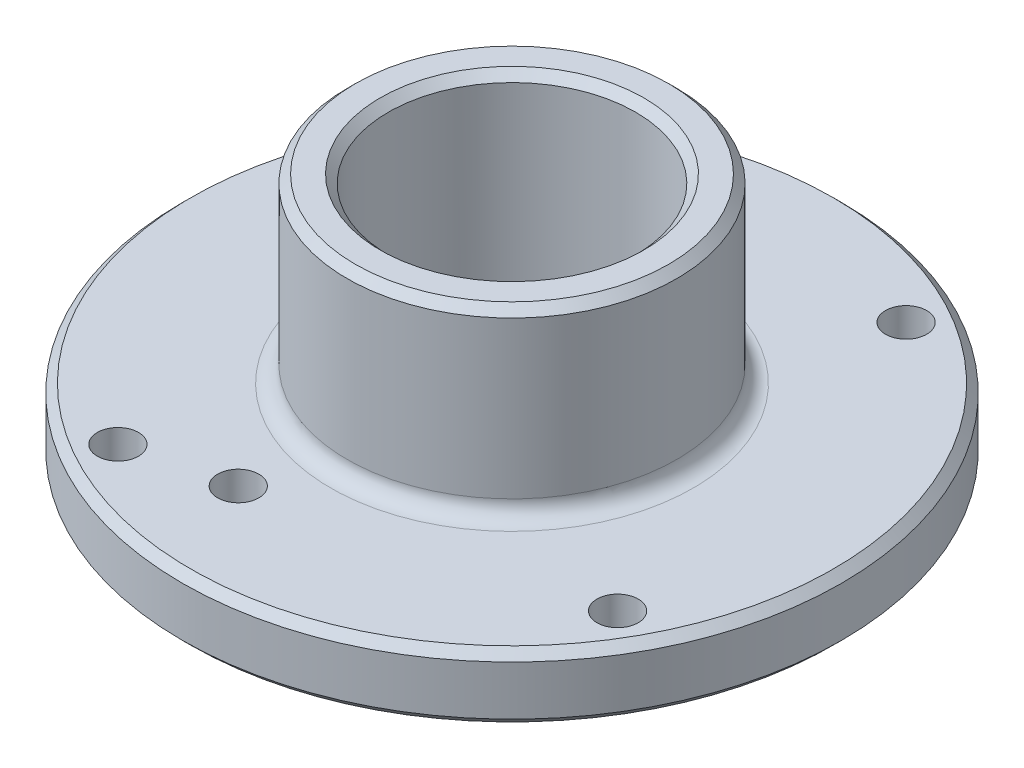
ISO-10303-21;
HEADER;
FILE_DESCRIPTION(('STEP AP214'),'2;1');
FILE_NAME('part.step','',(''),(''),'','','');
FILE_SCHEMA(('AUTOMOTIVE_DESIGN { 1 0 10303 214 1 1 1 1 }'));
ENDSEC;
DATA;
#1=APPLICATION_CONTEXT('core data for automotive mechanical design processes');
#2=APPLICATION_PROTOCOL_DEFINITION('international standard','automotive_design',2000,#1);
#3=PRODUCT_CONTEXT('',#1,'mechanical');
#4=PRODUCT('Part','Part','',(#3));
#5=PRODUCT_RELATED_PRODUCT_CATEGORY('part','',(#4));
#6=PRODUCT_DEFINITION_FORMATION('','',#4);
#7=PRODUCT_DEFINITION_CONTEXT('part definition',#1,'design');
#8=PRODUCT_DEFINITION('design','',#6,#7);
#9=PRODUCT_DEFINITION_SHAPE('','',#8);
#10=(LENGTH_UNIT() NAMED_UNIT(*) SI_UNIT(.MILLI.,.METRE.));
#11=(NAMED_UNIT(*) PLANE_ANGLE_UNIT() SI_UNIT($,.RADIAN.));
#12=(NAMED_UNIT(*) SI_UNIT($,.STERADIAN.) SOLID_ANGLE_UNIT());
#13=UNCERTAINTY_MEASURE_WITH_UNIT(LENGTH_MEASURE(1.E-05),#10,'distance_accuracy_value','');
#14=(GEOMETRIC_REPRESENTATION_CONTEXT(3) GLOBAL_UNCERTAINTY_ASSIGNED_CONTEXT((#13)) GLOBAL_UNIT_ASSIGNED_CONTEXT((#10,
#11,#12)) REPRESENTATION_CONTEXT('',''));
#15=CARTESIAN_POINT('',(0.,0.,0.));
#16=DIRECTION('',(0.,0.,1.));
#17=DIRECTION('',(1.,0.,0.));
#18=AXIS2_PLACEMENT_3D('',#15,#16,#17);
#19=CARTESIAN_POINT('',(-40.,0.,0.));
#20=DIRECTION('',(0.,1.,0.));
#21=DIRECTION('',(0.,0.,1.));
#22=AXIS2_PLACEMENT_3D('',#19,#20,#21);
#23=PLANE('',#22);
#24=CARTESIAN_POINT('',(-17.5,0.,30.3108891324553));
#25=DIRECTION('',(0.,1.,0.));
#26=DIRECTION('',(0.,0.,1.));
#27=AXIS2_PLACEMENT_3D('',#24,#25,#26);
#28=CIRCLE('',#27,2.5);
#29=CARTESIAN_POINT('',(-17.5,0.,32.8108891324554));
#30=VERTEX_POINT('',#29);
#31=EDGE_CURVE('E103',#30,#30,#28,.F.);
#32=ORIENTED_EDGE('',*,*,#31,.F.);
#33=EDGE_LOOP('',(#32));
#34=FACE_BOUND('',#33,.T.);
#35=CARTESIAN_POINT('',(-30.3108891324554,0.,-17.5));
#36=DIRECTION('',(0.,1.,0.));
#37=DIRECTION('',(0.,0.,1.));
#38=AXIS2_PLACEMENT_3D('',#35,#36,#37);
#39=CIRCLE('',#38,2.5);
#40=CARTESIAN_POINT('',(-30.3108891324554,0.,-15.));
#41=VERTEX_POINT('',#40);
#42=EDGE_CURVE('E117',#41,#41,#39,.F.);
#43=ORIENTED_EDGE('',*,*,#42,.F.);
#44=EDGE_LOOP('',(#43));
#45=FACE_BOUND('',#44,.T.);
#46=CARTESIAN_POINT('',(17.5,0.,-30.3108891324554));
#47=DIRECTION('',(0.,1.,0.));
#48=DIRECTION('',(0.,0.,1.));
#49=AXIS2_PLACEMENT_3D('',#46,#47,#48);
#50=CIRCLE('',#49,2.5);
#51=CARTESIAN_POINT('',(17.5,0.,-27.8108891324554));
#52=VERTEX_POINT('',#51);
#53=EDGE_CURVE('E108',#52,#52,#50,.F.);
#54=ORIENTED_EDGE('',*,*,#53,.F.);
#55=EDGE_LOOP('',(#54));
#56=FACE_BOUND('',#55,.T.);
#57=CARTESIAN_POINT('',(30.3108891324554,0.,17.5));
#58=DIRECTION('',(0.,1.,0.));
#59=DIRECTION('',(0.,0.,1.));
#60=AXIS2_PLACEMENT_3D('',#57,#58,#59);
#61=CIRCLE('',#60,2.50000000000001);
#62=CARTESIAN_POINT('',(30.3108891324554,0.,20.));
#63=VERTEX_POINT('',#62);
#64=EDGE_CURVE('E109',#63,#63,#61,.F.);
#65=ORIENTED_EDGE('',*,*,#64,.F.);
#66=EDGE_LOOP('',(#65));
#67=FACE_BOUND('',#66,.T.);
#68=CARTESIAN_POINT('',(-5.82152734289728,0.,27.3881328205466));
#69=DIRECTION('',(0.,-1.,0.));
#70=DIRECTION('',(0.,0.,-1.));
#71=AXIS2_PLACEMENT_3D('',#68,#69,#70);
#72=CIRCLE('',#71,2.5);
#73=CARTESIAN_POINT('',(-5.82152734289728,0.,24.8881328205466));
#74=VERTEX_POINT('',#73);
#75=EDGE_CURVE('E99',#74,#74,#72,.T.);
#76=ORIENTED_EDGE('',*,*,#75,.F.);
#77=EDGE_LOOP('',(#76));
#78=FACE_BOUND('',#77,.T.);
#79=CARTESIAN_POINT('',(0.,0.,0.));
#80=DIRECTION('',(0.,1.,0.));
#81=DIRECTION('',(0.,0.,1.));
#82=AXIS2_PLACEMENT_3D('',#79,#80,#81);
#83=CIRCLE('',#82,15.5);
#84=CARTESIAN_POINT('',(0.,0.,15.5));
#85=VERTEX_POINT('',#84);
#86=EDGE_CURVE('E10',#85,#85,#83,.T.);
#87=ORIENTED_EDGE('',*,*,#86,.T.);
#88=EDGE_LOOP('',(#87));
#89=FACE_BOUND('',#88,.T.);
#90=CARTESIAN_POINT('',(0.,0.,0.));
#91=DIRECTION('',(0.,1.,0.));
#92=DIRECTION('',(0.,0.,1.));
#93=AXIS2_PLACEMENT_3D('',#90,#91,#92);
#94=CIRCLE('',#93,39.);
#95=CARTESIAN_POINT('',(0.,0.,39.));
#96=VERTEX_POINT('',#95);
#97=EDGE_CURVE('E75',#96,#96,#94,.F.);
#98=ORIENTED_EDGE('',*,*,#97,.T.);
#99=EDGE_LOOP('',(#98));
#100=FACE_BOUND('',#99,.T.);
#101=ADVANCED_FACE('F42',(#34,#45,#56,#67,#78,#89,#100),#23,.F.);
#102=CARTESIAN_POINT('',(0.,0.,0.));
#103=DIRECTION('',(0.,-1.,0.));
#104=DIRECTION('',(0.,0.,-1.));
#105=AXIS2_PLACEMENT_3D('',#102,#103,#104);
#106=CYLINDRICAL_SURFACE('',#105,15.);
#107=CARTESIAN_POINT('',(0.,0.500000000000026,0.));
#108=DIRECTION('',(0.,1.,0.));
#109=DIRECTION('',(0.,0.,1.));
#110=AXIS2_PLACEMENT_3D('',#107,#108,#109);
#111=CIRCLE('',#110,15.);
#112=CARTESIAN_POINT('',(0.,0.500000000000026,15.));
#113=VERTEX_POINT('',#112);
#114=EDGE_CURVE('E52',#113,#113,#111,.F.);
#115=ORIENTED_EDGE('',*,*,#114,.T.);
#116=EDGE_LOOP('',(#115));
#117=FACE_BOUND('',#116,.T.);
#118=CARTESIAN_POINT('',(0.,29.,0.));
#119=DIRECTION('',(0.,-1.,0.));
#120=DIRECTION('',(0.,0.,-1.));
#121=AXIS2_PLACEMENT_3D('',#118,#119,#120);
#122=CIRCLE('',#121,15.);
#123=CARTESIAN_POINT('',(0.,29.,-15.));
#124=VERTEX_POINT('',#123);
#125=EDGE_CURVE('E63',#124,#124,#122,.F.);
#126=ORIENTED_EDGE('',*,*,#125,.T.);
#127=EDGE_LOOP('',(#126));
#128=FACE_BOUND('',#127,.T.);
#129=ADVANCED_FACE('F175',(#117,#128),#106,.F.);
#130=CARTESIAN_POINT('',(-15.,30.,0.));
#131=DIRECTION('',(0.,-1.,0.));
#132=DIRECTION('',(0.,0.,-1.));
#133=AXIS2_PLACEMENT_3D('',#130,#131,#132);
#134=PLANE('',#133);
#135=CARTESIAN_POINT('',(0.,30.,0.));
#136=DIRECTION('',(0.,-1.,0.));
#137=DIRECTION('',(0.,0.,-1.));
#138=AXIS2_PLACEMENT_3D('',#135,#136,#137);
#139=CIRCLE('',#138,16.);
#140=CARTESIAN_POINT('',(0.,30.,-16.));
#141=VERTEX_POINT('',#140);
#142=EDGE_CURVE('E67',#141,#141,#139,.T.);
#143=ORIENTED_EDGE('',*,*,#142,.T.);
#144=EDGE_LOOP('',(#143));
#145=FACE_BOUND('',#144,.T.);
#146=CARTESIAN_POINT('',(0.,30.,0.));
#147=DIRECTION('',(0.,-1.,0.));
#148=DIRECTION('',(0.,0.,-1.));
#149=AXIS2_PLACEMENT_3D('',#146,#147,#148);
#150=CIRCLE('',#149,19.);
#151=CARTESIAN_POINT('',(0.,30.,-19.));
#152=VERTEX_POINT('',#151);
#153=EDGE_CURVE('E71',#152,#152,#150,.F.);
#154=ORIENTED_EDGE('',*,*,#153,.T.);
#155=EDGE_LOOP('',(#154));
#156=FACE_BOUND('',#155,.T.);
#157=ADVANCED_FACE('F180',(#145,#156),#134,.F.);
#158=CARTESIAN_POINT('',(0.,0.,0.));
#159=DIRECTION('',(0.,-1.,0.));
#160=DIRECTION('',(0.,0.,-1.));
#161=AXIS2_PLACEMENT_3D('',#158,#159,#160);
#162=CYLINDRICAL_SURFACE('',#161,20.);
#163=CARTESIAN_POINT('',(0.,29.,0.));
#164=DIRECTION('',(0.,-1.,0.));
#165=DIRECTION('',(0.,0.,-1.));
#166=AXIS2_PLACEMENT_3D('',#163,#164,#165);
#167=CIRCLE('',#166,20.);
#168=CARTESIAN_POINT('',(0.,29.,-20.));
#169=VERTEX_POINT('',#168);
#170=EDGE_CURVE('E57',#169,#169,#167,.T.);
#171=ORIENTED_EDGE('',*,*,#170,.T.);
#172=EDGE_LOOP('',(#171));
#173=FACE_BOUND('',#172,.T.);
#174=CARTESIAN_POINT('',(0.,10.,0.));
#175=DIRECTION('',(0.,-1.,0.));
#176=DIRECTION('',(0.,0.,-1.));
#177=AXIS2_PLACEMENT_3D('',#174,#175,#176);
#178=CIRCLE('',#177,20.);
#179=CARTESIAN_POINT('',(0.,10.,-20.));
#180=VERTEX_POINT('',#179);
#181=EDGE_CURVE('E91',#180,#180,#178,.F.);
#182=ORIENTED_EDGE('',*,*,#181,.T.);
#183=EDGE_LOOP('',(#182));
#184=FACE_BOUND('',#183,.T.);
#185=ADVANCED_FACE('F143',(#173,#184),#162,.T.);
#186=CARTESIAN_POINT('',(-20.,8.,0.));
#187=DIRECTION('',(0.,-1.,0.));
#188=DIRECTION('',(0.,0.,-1.));
#189=AXIS2_PLACEMENT_3D('',#186,#187,#188);
#190=PLANE('',#189);
#191=CARTESIAN_POINT('',(-17.5,8.,30.3108891324553));
#192=DIRECTION('',(0.,1.,0.));
#193=DIRECTION('',(0.,0.,1.));
#194=AXIS2_PLACEMENT_3D('',#191,#192,#193);
#195=CIRCLE('',#194,2.5);
#196=CARTESIAN_POINT('',(-17.5,8.,32.8108891324554));
#197=VERTEX_POINT('',#196);
#198=EDGE_CURVE('E125',#197,#197,#195,.T.);
#199=ORIENTED_EDGE('',*,*,#198,.F.);
#200=EDGE_LOOP('',(#199));
#201=FACE_BOUND('',#200,.T.);
#202=CARTESIAN_POINT('',(-30.3108891324554,8.,-17.5));
#203=DIRECTION('',(0.,1.,0.));
#204=DIRECTION('',(0.,0.,1.));
#205=AXIS2_PLACEMENT_3D('',#202,#203,#204);
#206=CIRCLE('',#205,2.5);
#207=CARTESIAN_POINT('',(-30.3108891324554,8.,-15.));
#208=VERTEX_POINT('',#207);
#209=EDGE_CURVE('E121',#208,#208,#206,.T.);
#210=ORIENTED_EDGE('',*,*,#209,.F.);
#211=EDGE_LOOP('',(#210));
#212=FACE_BOUND('',#211,.T.);
#213=CARTESIAN_POINT('',(17.5,8.,-30.3108891324554));
#214=DIRECTION('',(0.,1.,0.));
#215=DIRECTION('',(0.,0.,1.));
#216=AXIS2_PLACEMENT_3D('',#213,#214,#215);
#217=CIRCLE('',#216,2.5);
#218=CARTESIAN_POINT('',(17.5,8.,-27.8108891324554));
#219=VERTEX_POINT('',#218);
#220=EDGE_CURVE('E113',#219,#219,#217,.T.);
#221=ORIENTED_EDGE('',*,*,#220,.F.);
#222=EDGE_LOOP('',(#221));
#223=FACE_BOUND('',#222,.T.);
#224=CARTESIAN_POINT('',(30.3108891324554,8.,17.5));
#225=DIRECTION('',(0.,1.,0.));
#226=DIRECTION('',(0.,0.,1.));
#227=AXIS2_PLACEMENT_3D('',#224,#225,#226);
#228=CIRCLE('',#227,2.50000000000001);
#229=CARTESIAN_POINT('',(30.3108891324554,8.,20.));
#230=VERTEX_POINT('',#229);
#231=EDGE_CURVE('E104',#230,#230,#228,.T.);
#232=ORIENTED_EDGE('',*,*,#231,.F.);
#233=EDGE_LOOP('',(#232));
#234=FACE_BOUND('',#233,.T.);
#235=CARTESIAN_POINT('',(-5.82152734289728,8.,27.3881328205466));
#236=DIRECTION('',(0.,-1.,0.));
#237=DIRECTION('',(0.,0.,-1.));
#238=AXIS2_PLACEMENT_3D('',#235,#236,#237);
#239=CIRCLE('',#238,2.5);
#240=CARTESIAN_POINT('',(-5.82152734289728,8.,24.8881328205466));
#241=VERTEX_POINT('',#240);
#242=EDGE_CURVE('E47',#241,#241,#239,.T.);
#243=ORIENTED_EDGE('',*,*,#242,.T.);
#244=EDGE_LOOP('',(#243));
#245=FACE_BOUND('',#244,.T.);
#246=CARTESIAN_POINT('',(0.,8.,0.));
#247=DIRECTION('',(0.,-1.,0.));
#248=DIRECTION('',(0.,0.,-1.));
#249=AXIS2_PLACEMENT_3D('',#246,#247,#248);
#250=CIRCLE('',#249,39.);
#251=CARTESIAN_POINT('',(0.,8.,-39.));
#252=VERTEX_POINT('',#251);
#253=EDGE_CURVE('E79',#252,#252,#250,.F.);
#254=ORIENTED_EDGE('',*,*,#253,.T.);
#255=EDGE_LOOP('',(#254));
#256=FACE_BOUND('',#255,.T.);
#257=CARTESIAN_POINT('',(0.,8.,0.));
#258=DIRECTION('',(0.,-1.,0.));
#259=DIRECTION('',(0.,0.,-1.));
#260=AXIS2_PLACEMENT_3D('',#257,#258,#259);
#261=CIRCLE('',#260,22.);
#262=CARTESIAN_POINT('',(0.,8.,-22.));
#263=VERTEX_POINT('',#262);
#264=EDGE_CURVE('E95',#263,#263,#261,.T.);
#265=ORIENTED_EDGE('',*,*,#264,.T.);
#266=EDGE_LOOP('',(#265));
#267=FACE_BOUND('',#266,.T.);
#268=ADVANCED_FACE('F139',(#201,#212,#223,#234,#245,#256,#267),#190,.F.);
#269=CARTESIAN_POINT('',(0.,0.,0.));
#270=DIRECTION('',(0.,-1.,0.));
#271=DIRECTION('',(0.,0.,-1.));
#272=AXIS2_PLACEMENT_3D('',#269,#270,#271);
#273=CYLINDRICAL_SURFACE('',#272,40.);
#274=CARTESIAN_POINT('',(0.,6.99999999999999,0.));
#275=DIRECTION('',(0.,-1.,0.));
#276=DIRECTION('',(0.,0.,-1.));
#277=AXIS2_PLACEMENT_3D('',#274,#275,#276);
#278=CIRCLE('',#277,40.);
#279=CARTESIAN_POINT('',(0.,6.99999999999999,-40.));
#280=VERTEX_POINT('',#279);
#281=EDGE_CURVE('E83',#280,#280,#278,.T.);
#282=ORIENTED_EDGE('',*,*,#281,.T.);
#283=EDGE_LOOP('',(#282));
#284=FACE_BOUND('',#283,.T.);
#285=CARTESIAN_POINT('',(0.,1.00000000000002,0.));
#286=DIRECTION('',(0.,1.,0.));
#287=DIRECTION('',(0.,0.,1.));
#288=AXIS2_PLACEMENT_3D('',#285,#286,#287);
#289=CIRCLE('',#288,40.);
#290=CARTESIAN_POINT('',(0.,1.00000000000002,40.));
#291=VERTEX_POINT('',#290);
#292=EDGE_CURVE('E87',#291,#291,#289,.T.);
#293=ORIENTED_EDGE('',*,*,#292,.T.);
#294=EDGE_LOOP('',(#293));
#295=FACE_BOUND('',#294,.T.);
#296=ADVANCED_FACE('F142',(#284,#295),#273,.T.);
#297=CARTESIAN_POINT('',(0.,10.,0.));
#298=DIRECTION('',(0.,-1.,0.));
#299=DIRECTION('',(0.,0.,-1.));
#300=AXIS2_PLACEMENT_3D('',#297,#298,#299);
#301=TOROIDAL_SURFACE('',#300,22.,2.);
#302=ORIENTED_EDGE('',*,*,#181,.F.);
#303=EDGE_LOOP('',(#302));
#304=FACE_BOUND('',#303,.T.);
#305=ORIENTED_EDGE('',*,*,#264,.F.);
#306=EDGE_LOOP('',(#305));
#307=FACE_BOUND('',#306,.T.);
#308=ADVANCED_FACE('F158',(#304,#307),#301,.F.);
#309=CARTESIAN_POINT('',(0.,6.99999999999999,0.));
#310=DIRECTION('',(0.,-1.,0.));
#311=DIRECTION('',(0.,0.,-1.));
#312=AXIS2_PLACEMENT_3D('',#309,#310,#311);
#313=CONICAL_SURFACE('',#312,40.,0.785398163397455);
#314=ORIENTED_EDGE('',*,*,#253,.F.);
#315=EDGE_LOOP('',(#314));
#316=FACE_BOUND('',#315,.T.);
#317=ORIENTED_EDGE('',*,*,#281,.F.);
#318=EDGE_LOOP('',(#317));
#319=FACE_BOUND('',#318,.T.);
#320=ADVANCED_FACE('F160',(#316,#319),#313,.T.);
#321=CARTESIAN_POINT('',(0.,0.,0.));
#322=DIRECTION('',(0.,1.,0.));
#323=DIRECTION('',(0.,0.,1.));
#324=AXIS2_PLACEMENT_3D('',#321,#322,#323);
#325=CONICAL_SURFACE('',#324,39.,0.785398163397441);
#326=ORIENTED_EDGE('',*,*,#292,.F.);
#327=EDGE_LOOP('',(#326));
#328=FACE_BOUND('',#327,.T.);
#329=ORIENTED_EDGE('',*,*,#97,.F.);
#330=EDGE_LOOP('',(#329));
#331=FACE_BOUND('',#330,.T.);
#332=ADVANCED_FACE('F167',(#328,#331),#325,.T.);
#333=CARTESIAN_POINT('',(0.,30.,0.));
#334=DIRECTION('',(0.,1.,0.));
#335=DIRECTION('',(0.,0.,1.));
#336=AXIS2_PLACEMENT_3D('',#333,#334,#335);
#337=CONICAL_SURFACE('',#336,16.,0.785398163397447);
#338=ORIENTED_EDGE('',*,*,#125,.F.);
#339=EDGE_LOOP('',(#338));
#340=FACE_BOUND('',#339,.T.);
#341=ORIENTED_EDGE('',*,*,#142,.F.);
#342=EDGE_LOOP('',(#341));
#343=FACE_BOUND('',#342,.T.);
#344=ADVANCED_FACE('F246',(#340,#343),#337,.F.);
#345=CARTESIAN_POINT('',(0.,29.,0.));
#346=DIRECTION('',(0.,-1.,0.));
#347=DIRECTION('',(0.,0.,-1.));
#348=AXIS2_PLACEMENT_3D('',#345,#346,#347);
#349=CONICAL_SURFACE('',#348,20.,0.785398163397448);
#350=ORIENTED_EDGE('',*,*,#153,.F.);
#351=EDGE_LOOP('',(#350));
#352=FACE_BOUND('',#351,.T.);
#353=ORIENTED_EDGE('',*,*,#170,.F.);
#354=EDGE_LOOP('',(#353));
#355=FACE_BOUND('',#354,.T.);
#356=ADVANCED_FACE('F238',(#352,#355),#349,.T.);
#357=CARTESIAN_POINT('',(0.,0.500000000000026,0.));
#358=DIRECTION('',(0.,-1.,0.));
#359=DIRECTION('',(0.,0.,-1.));
#360=AXIS2_PLACEMENT_3D('',#357,#358,#359);
#361=CONICAL_SURFACE('',#360,15.,0.785398163397438);
#362=ORIENTED_EDGE('',*,*,#86,.F.);
#363=EDGE_LOOP('',(#362));
#364=FACE_BOUND('',#363,.T.);
#365=ORIENTED_EDGE('',*,*,#114,.F.);
#366=EDGE_LOOP('',(#365));
#367=FACE_BOUND('',#366,.T.);
#368=ADVANCED_FACE('F45',(#364,#367),#361,.F.);
#369=CARTESIAN_POINT('',(-5.82152734289728,30.,27.3881328205466));
#370=DIRECTION('',(0.,-1.,0.));
#371=DIRECTION('',(0.,0.,-1.));
#372=AXIS2_PLACEMENT_3D('',#369,#370,#371);
#373=CYLINDRICAL_SURFACE('',#372,2.5);
#374=ORIENTED_EDGE('',*,*,#75,.T.);
#375=EDGE_LOOP('',(#374));
#376=FACE_BOUND('',#375,.T.);
#377=ORIENTED_EDGE('',*,*,#242,.F.);
#378=EDGE_LOOP('',(#377));
#379=FACE_BOUND('',#378,.T.);
#380=ADVANCED_FACE('F192',(#376,#379),#373,.F.);
#381=CARTESIAN_POINT('',(30.3108891324554,-0.000999999999999265,17.5));
#382=DIRECTION('',(0.,1.,0.));
#383=DIRECTION('',(0.,0.,1.));
#384=AXIS2_PLACEMENT_3D('',#381,#382,#383);
#385=CYLINDRICAL_SURFACE('',#384,2.50000000000001);
#386=ORIENTED_EDGE('',*,*,#231,.T.);
#387=EDGE_LOOP('',(#386));
#388=FACE_BOUND('',#387,.T.);
#389=ORIENTED_EDGE('',*,*,#64,.T.);
#390=EDGE_LOOP('',(#389));
#391=FACE_BOUND('',#390,.T.);
#392=ADVANCED_FACE('F195',(#388,#391),#385,.F.);
#393=CARTESIAN_POINT('',(17.5,-0.000999999999999265,-30.3108891324554));
#394=DIRECTION('',(0.,1.,0.));
#395=DIRECTION('',(0.,0.,1.));
#396=AXIS2_PLACEMENT_3D('',#393,#394,#395);
#397=CYLINDRICAL_SURFACE('',#396,2.5);
#398=ORIENTED_EDGE('',*,*,#220,.T.);
#399=EDGE_LOOP('',(#398));
#400=FACE_BOUND('',#399,.T.);
#401=ORIENTED_EDGE('',*,*,#53,.T.);
#402=EDGE_LOOP('',(#401));
#403=FACE_BOUND('',#402,.T.);
#404=ADVANCED_FACE('F199',(#400,#403),#397,.F.);
#405=CARTESIAN_POINT('',(-30.3108891324554,-0.000999999999999265,-17.5));
#406=DIRECTION('',(0.,1.,0.));
#407=DIRECTION('',(0.,0.,1.));
#408=AXIS2_PLACEMENT_3D('',#405,#406,#407);
#409=CYLINDRICAL_SURFACE('',#408,2.5);
#410=ORIENTED_EDGE('',*,*,#209,.T.);
#411=EDGE_LOOP('',(#410));
#412=FACE_BOUND('',#411,.T.);
#413=ORIENTED_EDGE('',*,*,#42,.T.);
#414=EDGE_LOOP('',(#413));
#415=FACE_BOUND('',#414,.T.);
#416=ADVANCED_FACE('F203',(#412,#415),#409,.F.);
#417=CARTESIAN_POINT('',(-17.5,-0.000999999999999265,30.3108891324553));
#418=DIRECTION('',(0.,1.,0.));
#419=DIRECTION('',(0.,0.,1.));
#420=AXIS2_PLACEMENT_3D('',#417,#418,#419);
#421=CYLINDRICAL_SURFACE('',#420,2.5);
#422=ORIENTED_EDGE('',*,*,#198,.T.);
#423=EDGE_LOOP('',(#422));
#424=FACE_BOUND('',#423,.T.);
#425=ORIENTED_EDGE('',*,*,#31,.T.);
#426=EDGE_LOOP('',(#425));
#427=FACE_BOUND('',#426,.T.);
#428=ADVANCED_FACE('F136',(#424,#427),#421,.F.);
#429=CLOSED_SHELL('',(#101,#129,#157,#185,#268,#296,#308,#320,#332,#344,#356,#368,#380,#392,
#404,#416,#428));
#430=MANIFOLD_SOLID_BREP('B2',#429);
#431=ADVANCED_BREP_SHAPE_REPRESENTATION('',(#18,#430),#14);
#432=SHAPE_DEFINITION_REPRESENTATION(#9,#431);
ENDSEC;
END-ISO-10303-21;
